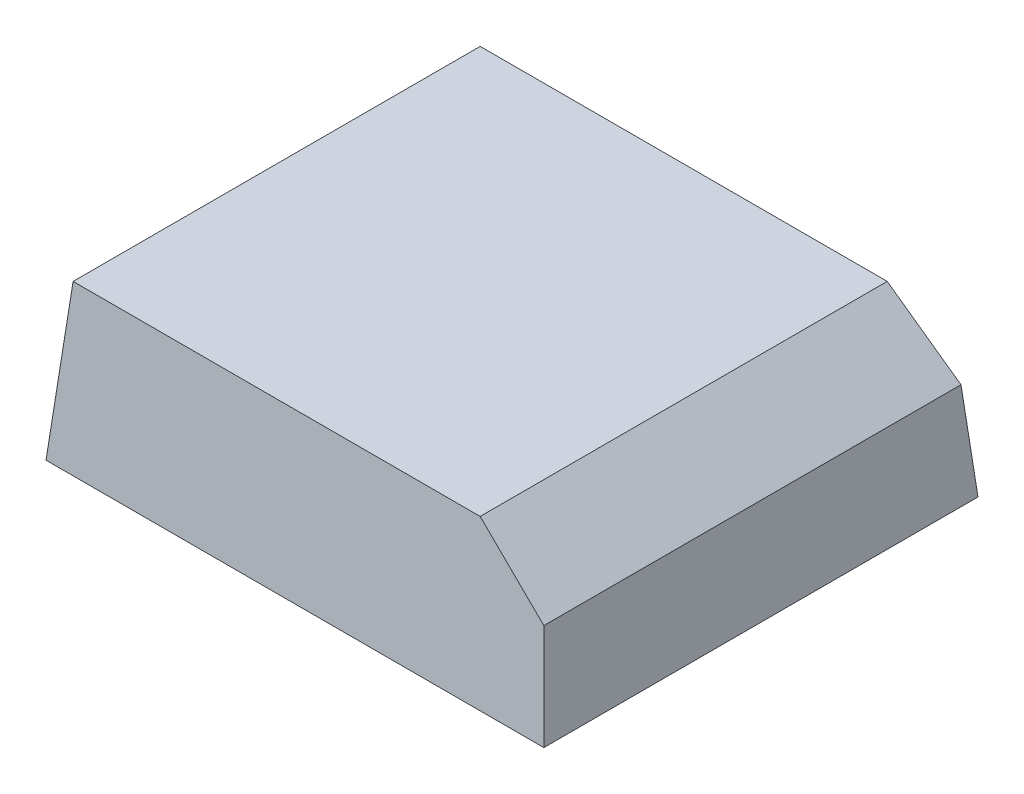
ISO-10303-21;
HEADER;
FILE_DESCRIPTION(('STEP AP214'),'2;1');
FILE_NAME('part.step','',(''),(''),'','','');
FILE_SCHEMA(('AUTOMOTIVE_DESIGN { 1 0 10303 214 1 1 1 1 }'));
ENDSEC;
DATA;
#1=APPLICATION_CONTEXT('core data for automotive mechanical design processes');
#2=APPLICATION_PROTOCOL_DEFINITION('international standard','automotive_design',2000,#1);
#3=PRODUCT_CONTEXT('',#1,'mechanical');
#4=PRODUCT('Part','Part','',(#3));
#5=PRODUCT_RELATED_PRODUCT_CATEGORY('part','',(#4));
#6=PRODUCT_DEFINITION_FORMATION('','',#4);
#7=PRODUCT_DEFINITION_CONTEXT('part definition',#1,'design');
#8=PRODUCT_DEFINITION('design','',#6,#7);
#9=PRODUCT_DEFINITION_SHAPE('','',#8);
#10=(LENGTH_UNIT() NAMED_UNIT(*) SI_UNIT(.MILLI.,.METRE.));
#11=(NAMED_UNIT(*) PLANE_ANGLE_UNIT() SI_UNIT($,.RADIAN.));
#12=(NAMED_UNIT(*) SI_UNIT($,.STERADIAN.) SOLID_ANGLE_UNIT());
#13=UNCERTAINTY_MEASURE_WITH_UNIT(LENGTH_MEASURE(1.E-05),#10,'distance_accuracy_value','');
#14=(GEOMETRIC_REPRESENTATION_CONTEXT(3) GLOBAL_UNCERTAINTY_ASSIGNED_CONTEXT((#13)) GLOBAL_UNIT_ASSIGNED_CONTEXT((#10,
#11,#12)) REPRESENTATION_CONTEXT('',''));
#15=CARTESIAN_POINT('',(0.,0.,0.));
#16=DIRECTION('',(0.,0.,1.));
#17=DIRECTION('',(1.,0.,0.));
#18=AXIS2_PLACEMENT_3D('',#15,#16,#17);
#19=CARTESIAN_POINT('',(1.186361982977,1.07,0.));
#20=DIRECTION('',(-0.642787609686799,-0.76604444311876,0.));
#21=DIRECTION('',(0.76604444311876,-0.642787609686799,0.));
#22=AXIS2_PLACEMENT_3D('',#19,#20,#21);
#23=PLANE('',#22);
#24=DIRECTION('',(0.,0.,1.));
#25=VECTOR('',#24,1.);
#26=CARTESIAN_POINT('',(1.66124942712638,0.671522120763033,1.5));
#27=LINE('',#26,#25);
#28=CARTESIAN_POINT('',(1.66124942712624,0.671522120763186,-1.44124942712609));
#29=VERTEX_POINT('',#28);
#30=CARTESIAN_POINT('',(1.66124942712624,0.671522120763186,1.44124942712609));
#31=VERTEX_POINT('',#30);
#32=EDGE_CURVE('E60',#29,#31,#27,.T.);
#33=ORIENTED_EDGE('',*,*,#32,.F.);
#34=DIRECTION('',(0.764835978588505,-0.641773587545171,-0.0561479134604676));
#35=VECTOR('',#34,1.);
#36=CARTESIAN_POINT('',(1.186361982977,1.07,-1.406387130027));
#37=LINE('',#36,#35);
#38=CARTESIAN_POINT('',(1.186361982977,1.07000000000001,-1.40638713002708));
#39=VERTEX_POINT('',#38);
#40=EDGE_CURVE('E20',#39,#29,#37,.T.);
#41=ORIENTED_EDGE('',*,*,#40,.F.);
#42=DIRECTION('',(0.,0.,1.));
#43=VECTOR('',#42,1.);
#44=CARTESIAN_POINT('',(1.186361982977,1.07,0.));
#45=LINE('',#44,#43);
#46=CARTESIAN_POINT('',(1.186361982977,1.07000000000001,1.40638713002708));
#47=VERTEX_POINT('',#46);
#48=EDGE_CURVE('E75',#47,#39,#45,.F.);
#49=ORIENTED_EDGE('',*,*,#48,.F.);
#50=DIRECTION('',(-0.764835978588047,0.641773587545707,-0.0561479134605853));
#51=VECTOR('',#50,1.);
#52=CARTESIAN_POINT('',(1.661249427126,0.671522120763033,1.44124942712638));
#53=LINE('',#52,#51);
#54=EDGE_CURVE('E65',#31,#47,#53,.T.);
#55=ORIENTED_EDGE('',*,*,#54,.F.);
#56=EDGE_LOOP('',(#33,#41,#49,#55));
#57=FACE_BOUND('',#56,.T.);
#58=ADVANCED_FACE('F17',(#57),#23,.F.);
#59=CARTESIAN_POINT('',(0.,1.07,0.));
#60=DIRECTION('',(0.,1.,0.));
#61=DIRECTION('',(0.,0.,1.));
#62=AXIS2_PLACEMENT_3D('',#59,#60,#61);
#63=PLANE('',#62);
#64=DIRECTION('',(1.,0.,0.));
#65=VECTOR('',#64,1.);
#66=CARTESIAN_POINT('',(1.72,1.07000000000003,-1.4063871300273));
#67=LINE('',#66,#65);
#68=CARTESIAN_POINT('',(-1.62638713002708,1.07000000000001,-1.40638713002708));
#69=VERTEX_POINT('',#68);
#70=EDGE_CURVE('E88',#69,#39,#67,.T.);
#71=ORIENTED_EDGE('',*,*,#70,.F.);
#72=DIRECTION('',(0.,0.,1.));
#73=VECTOR('',#72,1.);
#74=CARTESIAN_POINT('',(-1.6263871300273,1.07000000000003,1.5));
#75=LINE('',#74,#73);
#76=CARTESIAN_POINT('',(-1.62638713002708,1.07000000000002,1.40638713002715));
#77=VERTEX_POINT('',#76);
#78=EDGE_CURVE('E83',#77,#69,#75,.F.);
#79=ORIENTED_EDGE('',*,*,#78,.F.);
#80=DIRECTION('',(1.,0.,0.));
#81=VECTOR('',#80,1.);
#82=CARTESIAN_POINT('',(1.72,1.07000000000003,1.4063871300273));
#83=LINE('',#82,#81);
#84=EDGE_CURVE('E70',#47,#77,#83,.F.);
#85=ORIENTED_EDGE('',*,*,#84,.F.);
#86=ORIENTED_EDGE('',*,*,#48,.T.);
#87=EDGE_LOOP('',(#71,#79,#85,#86));
#88=FACE_BOUND('',#87,.T.);
#89=ADVANCED_FACE('F82',(#88),#63,.T.);
#90=CARTESIAN_POINT('',(1.72,0.,1.5));
#91=DIRECTION('',(0.,0.0871557427476181,0.996194698091749));
#92=DIRECTION('',(0.,-0.996194698091749,0.0871557427476181));
#93=AXIS2_PLACEMENT_3D('',#90,#91,#92);
#94=PLANE('',#93);
#95=DIRECTION('',(0.0868265938642057,0.99243250913895,-0.0868265938644863));
#96=VECTOR('',#95,1.);
#97=CARTESIAN_POINT('',(-1.72,0.,1.5));
#98=LINE('',#97,#96);
#99=CARTESIAN_POINT('',(-1.72,0.,1.5));
#100=VERTEX_POINT('',#99);
#101=EDGE_CURVE('E92',#100,#77,#98,.T.);
#102=ORIENTED_EDGE('',*,*,#101,.F.);
#103=DIRECTION('',(1.,0.,0.));
#104=VECTOR('',#103,1.);
#105=CARTESIAN_POINT('',(0.,0.,1.5));
#106=LINE('',#105,#104);
#107=CARTESIAN_POINT('',(1.72,0.,1.5));
#108=VERTEX_POINT('',#107);
#109=EDGE_CURVE('E96',#100,#108,#106,.T.);
#110=ORIENTED_EDGE('',*,*,#109,.T.);
#111=DIRECTION('',(0.0868265938642037,-0.992432509138926,0.0868265938647588));
#112=VECTOR('',#111,1.);
#113=CARTESIAN_POINT('',(1.66124942712638,0.671522120763033,1.441249427126));
#114=LINE('',#113,#112);
#115=EDGE_CURVE('E73',#31,#108,#114,.T.);
#116=ORIENTED_EDGE('',*,*,#115,.F.);
#117=ORIENTED_EDGE('',*,*,#54,.T.);
#118=ORIENTED_EDGE('',*,*,#84,.T.);
#119=EDGE_LOOP('',(#102,#110,#116,#117,#118));
#120=FACE_BOUND('',#119,.T.);
#121=ADVANCED_FACE('F68',(#120),#94,.T.);
#122=CARTESIAN_POINT('',(1.72,0.,1.5));
#123=DIRECTION('',(0.996194698091749,0.0871557427476181,0.));
#124=DIRECTION('',(-0.0871557427476181,0.996194698091749,0.));
#125=AXIS2_PLACEMENT_3D('',#122,#123,#124);
#126=PLANE('',#125);
#127=ORIENTED_EDGE('',*,*,#115,.T.);
#128=DIRECTION('',(0.,0.,1.));
#129=VECTOR('',#128,1.);
#130=CARTESIAN_POINT('',(1.72,0.,0.));
#131=LINE('',#130,#129);
#132=CARTESIAN_POINT('',(1.72,0.,-1.5));
#133=VERTEX_POINT('',#132);
#134=EDGE_CURVE('E98',#108,#133,#131,.F.);
#135=ORIENTED_EDGE('',*,*,#134,.T.);
#136=DIRECTION('',(0.0868265938647581,-0.992432509138926,-0.0868265938642037));
#137=VECTOR('',#136,1.);
#138=CARTESIAN_POINT('',(1.661249427126,0.671522120763033,-1.44124942712638));
#139=LINE('',#138,#137);
#140=EDGE_CURVE('E90',#29,#133,#139,.T.);
#141=ORIENTED_EDGE('',*,*,#140,.F.);
#142=ORIENTED_EDGE('',*,*,#32,.T.);
#143=EDGE_LOOP('',(#127,#135,#141,#142));
#144=FACE_BOUND('',#143,.T.);
#145=ADVANCED_FACE('F108',(#144),#126,.T.);
#146=CARTESIAN_POINT('',(1.72,0.,-1.5));
#147=DIRECTION('',(0.,0.0871557427476181,-0.996194698091749));
#148=DIRECTION('',(0.,0.996194698091749,0.0871557427476181));
#149=AXIS2_PLACEMENT_3D('',#146,#147,#148);
#150=PLANE('',#149);
#151=DIRECTION('',(1.,0.,0.));
#152=VECTOR('',#151,1.);
#153=CARTESIAN_POINT('',(0.,0.,-1.5));
#154=LINE('',#153,#152);
#155=CARTESIAN_POINT('',(-1.72,0.,-1.5));
#156=VERTEX_POINT('',#155);
#157=EDGE_CURVE('E26',#133,#156,#154,.F.);
#158=ORIENTED_EDGE('',*,*,#157,.T.);
#159=DIRECTION('',(-0.0868265938642057,-0.99243250913895,-0.0868265938644869));
#160=VECTOR('',#159,1.);
#161=CARTESIAN_POINT('',(-1.6263871300273,1.07000000000003,-1.406387130027));
#162=LINE('',#161,#160);
#163=EDGE_CURVE('E34',#69,#156,#162,.T.);
#164=ORIENTED_EDGE('',*,*,#163,.F.);
#165=ORIENTED_EDGE('',*,*,#70,.T.);
#166=ORIENTED_EDGE('',*,*,#40,.T.);
#167=ORIENTED_EDGE('',*,*,#140,.T.);
#168=EDGE_LOOP('',(#158,#164,#165,#166,#167));
#169=FACE_BOUND('',#168,.T.);
#170=ADVANCED_FACE('F104',(#169),#150,.T.);
#171=CARTESIAN_POINT('',(-1.72,0.,1.5));
#172=DIRECTION('',(-0.996194698091749,0.0871557427476181,0.));
#173=DIRECTION('',(-0.0871557427476181,-0.996194698091749,0.));
#174=AXIS2_PLACEMENT_3D('',#171,#172,#173);
#175=PLANE('',#174);
#176=ORIENTED_EDGE('',*,*,#78,.T.);
#177=ORIENTED_EDGE('',*,*,#163,.T.);
#178=DIRECTION('',(0.,0.,1.));
#179=VECTOR('',#178,1.);
#180=CARTESIAN_POINT('',(-1.72,0.,0.));
#181=LINE('',#180,#179);
#182=EDGE_CURVE('E11',#156,#100,#181,.T.);
#183=ORIENTED_EDGE('',*,*,#182,.T.);
#184=ORIENTED_EDGE('',*,*,#101,.T.);
#185=EDGE_LOOP('',(#176,#177,#183,#184));
#186=FACE_BOUND('',#185,.T.);
#187=ADVANCED_FACE('F116',(#186),#175,.T.);
#188=CARTESIAN_POINT('',(0.,0.,0.));
#189=DIRECTION('',(0.,1.,0.));
#190=DIRECTION('',(0.,0.,1.));
#191=AXIS2_PLACEMENT_3D('',#188,#189,#190);
#192=PLANE('',#191);
#193=ORIENTED_EDGE('',*,*,#157,.F.);
#194=ORIENTED_EDGE('',*,*,#134,.F.);
#195=ORIENTED_EDGE('',*,*,#109,.F.);
#196=ORIENTED_EDGE('',*,*,#182,.F.);
#197=EDGE_LOOP('',(#193,#194,#195,#196));
#198=FACE_BOUND('',#197,.T.);
#199=ADVANCED_FACE('F107',(#198),#192,.F.);
#200=CLOSED_SHELL('',(#58,#89,#121,#145,#170,#187,#199));
#201=MANIFOLD_SOLID_BREP('B1',#200);
#202=ADVANCED_BREP_SHAPE_REPRESENTATION('',(#18,#201),#14);
#203=SHAPE_DEFINITION_REPRESENTATION(#9,#202);
ENDSEC;
END-ISO-10303-21;
